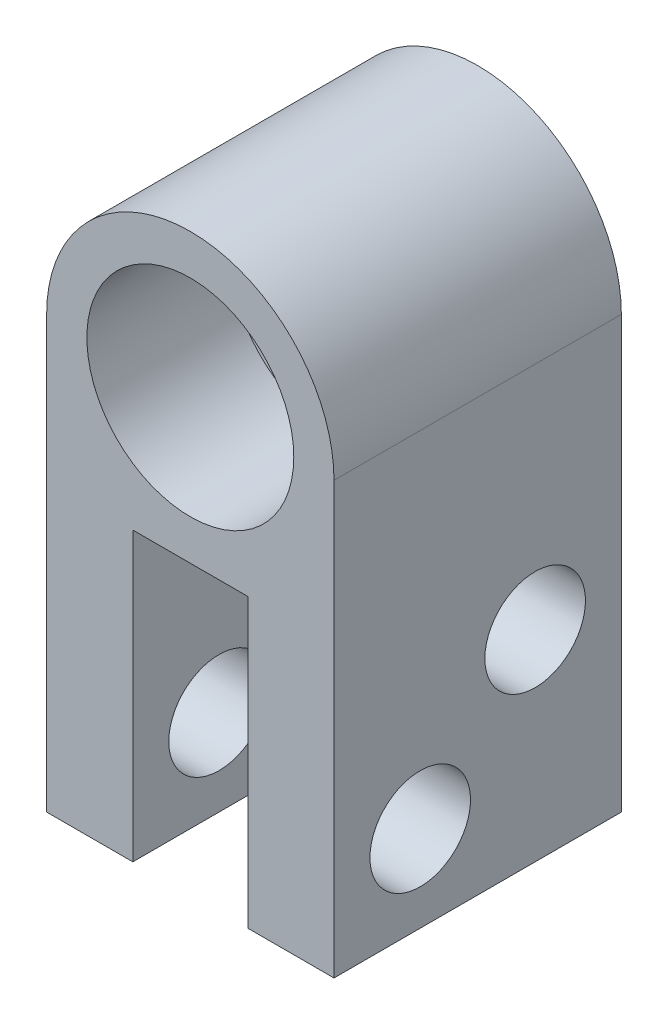
ISO-10303-21;
HEADER;
FILE_DESCRIPTION(('STEP AP214'),'2;1');
FILE_NAME('part.step','',(''),(''),'','','');
FILE_SCHEMA(('AUTOMOTIVE_DESIGN { 1 0 10303 214 1 1 1 1 }'));
ENDSEC;
DATA;
#1=APPLICATION_CONTEXT('core data for automotive mechanical design processes');
#2=APPLICATION_PROTOCOL_DEFINITION('international standard','automotive_design',2000,#1);
#3=PRODUCT_CONTEXT('',#1,'mechanical');
#4=PRODUCT('Part','Part','',(#3));
#5=PRODUCT_RELATED_PRODUCT_CATEGORY('part','',(#4));
#6=PRODUCT_DEFINITION_FORMATION('','',#4);
#7=PRODUCT_DEFINITION_CONTEXT('part definition',#1,'design');
#8=PRODUCT_DEFINITION('design','',#6,#7);
#9=PRODUCT_DEFINITION_SHAPE('','',#8);
#10=(LENGTH_UNIT() NAMED_UNIT(*) SI_UNIT(.MILLI.,.METRE.));
#11=(NAMED_UNIT(*) PLANE_ANGLE_UNIT() SI_UNIT($,.RADIAN.));
#12=(NAMED_UNIT(*) SI_UNIT($,.STERADIAN.) SOLID_ANGLE_UNIT());
#13=UNCERTAINTY_MEASURE_WITH_UNIT(LENGTH_MEASURE(1.E-05),#10,'distance_accuracy_value','');
#14=(GEOMETRIC_REPRESENTATION_CONTEXT(3) GLOBAL_UNCERTAINTY_ASSIGNED_CONTEXT((#13)) GLOBAL_UNIT_ASSIGNED_CONTEXT((#10,
#11,#12)) REPRESENTATION_CONTEXT('',''));
#15=CARTESIAN_POINT('',(0.,0.,0.));
#16=DIRECTION('',(0.,0.,1.));
#17=DIRECTION('',(1.,0.,0.));
#18=AXIS2_PLACEMENT_3D('',#15,#16,#17);
#19=CARTESIAN_POINT('',(0.,0.,10.));
#20=DIRECTION('',(0.,0.,-1.));
#21=DIRECTION('',(-1.,0.,0.));
#22=AXIS2_PLACEMENT_3D('',#19,#20,#21);
#23=CYLINDRICAL_SURFACE('',#22,5.);
#24=DIRECTION('',(0.,0.,1.));
#25=VECTOR('',#24,1.);
#26=CARTESIAN_POINT('',(-5.,0.,0.));
#27=LINE('',#26,#25);
#28=CARTESIAN_POINT('',(-5.,0.,0.));
#29=VERTEX_POINT('',#28);
#30=CARTESIAN_POINT('',(-5.,0.,10.));
#31=VERTEX_POINT('',#30);
#32=EDGE_CURVE('E150',#29,#31,#27,.T.);
#33=ORIENTED_EDGE('',*,*,#32,.T.);
#34=CARTESIAN_POINT('',(0.,0.,10.));
#35=DIRECTION('',(0.,0.,1.));
#36=DIRECTION('',(1.,0.,0.));
#37=AXIS2_PLACEMENT_3D('',#34,#35,#36);
#38=CIRCLE('',#37,5.);
#39=CARTESIAN_POINT('',(5.,0.,10.));
#40=VERTEX_POINT('',#39);
#41=EDGE_CURVE('E11',#40,#31,#38,.T.);
#42=ORIENTED_EDGE('',*,*,#41,.F.);
#43=DIRECTION('',(0.,0.,1.));
#44=VECTOR('',#43,1.);
#45=CARTESIAN_POINT('',(5.,0.,0.));
#46=LINE('',#45,#44);
#47=CARTESIAN_POINT('',(5.,0.,0.));
#48=VERTEX_POINT('',#47);
#49=EDGE_CURVE('E117',#48,#40,#46,.T.);
#50=ORIENTED_EDGE('',*,*,#49,.F.);
#51=CARTESIAN_POINT('',(0.,0.,0.));
#52=DIRECTION('',(0.,0.,1.));
#53=DIRECTION('',(1.,0.,0.));
#54=AXIS2_PLACEMENT_3D('',#51,#52,#53);
#55=CIRCLE('',#54,5.);
#56=EDGE_CURVE('E43',#48,#29,#55,.T.);
#57=ORIENTED_EDGE('',*,*,#56,.T.);
#58=EDGE_LOOP('',(#33,#42,#50,#57));
#59=FACE_BOUND('',#58,.T.);
#60=ADVANCED_FACE('F35',(#59),#23,.T.);
#61=CARTESIAN_POINT('',(0.,0.,10.));
#62=DIRECTION('',(0.,0.,-1.));
#63=DIRECTION('',(-1.,0.,0.));
#64=AXIS2_PLACEMENT_3D('',#61,#62,#63);
#65=CYLINDRICAL_SURFACE('',#64,1.75);
#66=CARTESIAN_POINT('',(0.,0.,0.));
#67=DIRECTION('',(0.,0.,1.));
#68=DIRECTION('',(1.,0.,0.));
#69=AXIS2_PLACEMENT_3D('',#66,#67,#68);
#70=CIRCLE('',#69,1.75);
#71=CARTESIAN_POINT('',(1.75,0.,0.));
#72=VERTEX_POINT('',#71);
#73=EDGE_CURVE('E170',#72,#72,#70,.T.);
#74=ORIENTED_EDGE('',*,*,#73,.F.);
#75=EDGE_LOOP('',(#74));
#76=FACE_BOUND('',#75,.T.);
#77=CARTESIAN_POINT('',(0.,0.,5.));
#78=DIRECTION('',(0.,0.,1.));
#79=DIRECTION('',(1.,0.,0.));
#80=AXIS2_PLACEMENT_3D('',#77,#78,#79);
#81=CIRCLE('',#80,1.75);
#82=CARTESIAN_POINT('',(1.75,0.,5.));
#83=VERTEX_POINT('',#82);
#84=EDGE_CURVE('E167',#83,#83,#81,.T.);
#85=ORIENTED_EDGE('',*,*,#84,.T.);
#86=EDGE_LOOP('',(#85));
#87=FACE_BOUND('',#86,.T.);
#88=ADVANCED_FACE('F237',(#76,#87),#65,.F.);
#89=CARTESIAN_POINT('',(0.,0.,10.));
#90=DIRECTION('',(0.,0.,1.));
#91=DIRECTION('',(1.,0.,0.));
#92=AXIS2_PLACEMENT_3D('',#89,#90,#91);
#93=PLANE('',#92);
#94=ORIENTED_EDGE('',*,*,#41,.T.);
#95=DIRECTION('',(0.,1.,0.));
#96=VECTOR('',#95,1.);
#97=CARTESIAN_POINT('',(-5.,0.,10.));
#98=LINE('',#97,#96);
#99=CARTESIAN_POINT('',(-5.,-15.,10.));
#100=VERTEX_POINT('',#99);
#101=EDGE_CURVE('E89',#100,#31,#98,.T.);
#102=ORIENTED_EDGE('',*,*,#101,.F.);
#103=DIRECTION('',(-1.,0.,0.));
#104=VECTOR('',#103,1.);
#105=CARTESIAN_POINT('',(0.,-15.,10.));
#106=LINE('',#105,#104);
#107=CARTESIAN_POINT('',(-2.,-15.,10.));
#108=VERTEX_POINT('',#107);
#109=EDGE_CURVE('E137',#108,#100,#106,.T.);
#110=ORIENTED_EDGE('',*,*,#109,.F.);
#111=DIRECTION('',(0.,-1.,0.));
#112=VECTOR('',#111,1.);
#113=CARTESIAN_POINT('',(-2.,0.,10.));
#114=LINE('',#113,#112);
#115=CARTESIAN_POINT('',(-2.,-5.,10.));
#116=VERTEX_POINT('',#115);
#117=EDGE_CURVE('E140',#116,#108,#114,.T.);
#118=ORIENTED_EDGE('',*,*,#117,.F.);
#119=DIRECTION('',(-1.,0.,0.));
#120=VECTOR('',#119,1.);
#121=CARTESIAN_POINT('',(0.,-5.,10.));
#122=LINE('',#121,#120);
#123=CARTESIAN_POINT('',(2.,-5.,10.));
#124=VERTEX_POINT('',#123);
#125=EDGE_CURVE('E142',#124,#116,#122,.T.);
#126=ORIENTED_EDGE('',*,*,#125,.F.);
#127=DIRECTION('',(0.,-1.,0.));
#128=VECTOR('',#127,1.);
#129=CARTESIAN_POINT('',(2.,0.,10.));
#130=LINE('',#129,#128);
#131=CARTESIAN_POINT('',(2.,-15.,10.));
#132=VERTEX_POINT('',#131);
#133=EDGE_CURVE('E144',#124,#132,#130,.T.);
#134=ORIENTED_EDGE('',*,*,#133,.T.);
#135=DIRECTION('',(1.,0.,0.));
#136=VECTOR('',#135,1.);
#137=CARTESIAN_POINT('',(0.,-15.,10.));
#138=LINE('',#137,#136);
#139=CARTESIAN_POINT('',(5.,-15.,10.));
#140=VERTEX_POINT('',#139);
#141=EDGE_CURVE('E147',#132,#140,#138,.T.);
#142=ORIENTED_EDGE('',*,*,#141,.T.);
#143=DIRECTION('',(0.,1.,0.));
#144=VECTOR('',#143,1.);
#145=CARTESIAN_POINT('',(5.,0.,10.));
#146=LINE('',#145,#144);
#147=EDGE_CURVE('E50',#140,#40,#146,.T.);
#148=ORIENTED_EDGE('',*,*,#147,.T.);
#149=EDGE_LOOP('',(#94,#102,#110,#118,#126,#134,#142,#148));
#150=FACE_BOUND('',#149,.T.);
#151=CARTESIAN_POINT('',(0.,0.,10.));
#152=DIRECTION('',(0.,0.,1.));
#153=DIRECTION('',(1.,0.,0.));
#154=AXIS2_PLACEMENT_3D('',#151,#152,#153);
#155=CIRCLE('',#154,3.6);
#156=CARTESIAN_POINT('',(3.6,0.,10.));
#157=VERTEX_POINT('',#156);
#158=EDGE_CURVE('E152',#157,#157,#155,.T.);
#159=ORIENTED_EDGE('',*,*,#158,.F.);
#160=EDGE_LOOP('',(#159));
#161=FACE_BOUND('',#160,.T.);
#162=ADVANCED_FACE('F218',(#150,#161),#93,.T.);
#163=CARTESIAN_POINT('',(0.,0.,0.));
#164=DIRECTION('',(0.,0.,1.));
#165=DIRECTION('',(1.,0.,0.));
#166=AXIS2_PLACEMENT_3D('',#163,#164,#165);
#167=PLANE('',#166);
#168=DIRECTION('',(0.,-1.,0.));
#169=VECTOR('',#168,1.);
#170=CARTESIAN_POINT('',(2.,0.,0.));
#171=LINE('',#170,#169);
#172=CARTESIAN_POINT('',(2.,-5.,0.));
#173=VERTEX_POINT('',#172);
#174=CARTESIAN_POINT('',(2.,-15.,0.));
#175=VERTEX_POINT('',#174);
#176=EDGE_CURVE('E130',#173,#175,#171,.T.);
#177=ORIENTED_EDGE('',*,*,#176,.F.);
#178=DIRECTION('',(-1.,0.,0.));
#179=VECTOR('',#178,1.);
#180=CARTESIAN_POINT('',(0.,-5.,0.));
#181=LINE('',#180,#179);
#182=CARTESIAN_POINT('',(-2.,-5.,0.));
#183=VERTEX_POINT('',#182);
#184=EDGE_CURVE('E132',#173,#183,#181,.T.);
#185=ORIENTED_EDGE('',*,*,#184,.T.);
#186=DIRECTION('',(0.,-1.,0.));
#187=VECTOR('',#186,1.);
#188=CARTESIAN_POINT('',(-2.,0.,0.));
#189=LINE('',#188,#187);
#190=CARTESIAN_POINT('',(-2.,-15.,0.));
#191=VERTEX_POINT('',#190);
#192=EDGE_CURVE('E201',#183,#191,#189,.T.);
#193=ORIENTED_EDGE('',*,*,#192,.T.);
#194=DIRECTION('',(-1.,0.,0.));
#195=VECTOR('',#194,1.);
#196=CARTESIAN_POINT('',(0.,-15.,0.));
#197=LINE('',#196,#195);
#198=CARTESIAN_POINT('',(-5.,-15.,0.));
#199=VERTEX_POINT('',#198);
#200=EDGE_CURVE('E95',#191,#199,#197,.T.);
#201=ORIENTED_EDGE('',*,*,#200,.T.);
#202=DIRECTION('',(0.,1.,0.));
#203=VECTOR('',#202,1.);
#204=CARTESIAN_POINT('',(-5.,0.,0.));
#205=LINE('',#204,#203);
#206=EDGE_CURVE('E59',#199,#29,#205,.T.);
#207=ORIENTED_EDGE('',*,*,#206,.T.);
#208=ORIENTED_EDGE('',*,*,#56,.F.);
#209=DIRECTION('',(0.,1.,0.));
#210=VECTOR('',#209,1.);
#211=CARTESIAN_POINT('',(5.,0.,0.));
#212=LINE('',#211,#210);
#213=CARTESIAN_POINT('',(5.,-15.,0.));
#214=VERTEX_POINT('',#213);
#215=EDGE_CURVE('E112',#214,#48,#212,.T.);
#216=ORIENTED_EDGE('',*,*,#215,.F.);
#217=DIRECTION('',(1.,0.,0.));
#218=VECTOR('',#217,1.);
#219=CARTESIAN_POINT('',(0.,-15.,0.));
#220=LINE('',#219,#218);
#221=EDGE_CURVE('E124',#175,#214,#220,.T.);
#222=ORIENTED_EDGE('',*,*,#221,.F.);
#223=EDGE_LOOP('',(#177,#185,#193,#201,#207,#208,#216,#222));
#224=FACE_BOUND('',#223,.T.);
#225=ORIENTED_EDGE('',*,*,#73,.T.);
#226=EDGE_LOOP('',(#225));
#227=FACE_BOUND('',#226,.T.);
#228=ADVANCED_FACE('F122',(#224,#227),#167,.F.);
#229=CARTESIAN_POINT('',(0.,0.,5.));
#230=DIRECTION('',(0.,0.,1.));
#231=DIRECTION('',(1.,0.,0.));
#232=AXIS2_PLACEMENT_3D('',#229,#230,#231);
#233=CYLINDRICAL_SURFACE('',#232,3.6);
#234=CARTESIAN_POINT('',(0.,0.,5.));
#235=DIRECTION('',(0.,0.,1.));
#236=DIRECTION('',(1.,0.,0.));
#237=AXIS2_PLACEMENT_3D('',#234,#235,#236);
#238=CIRCLE('',#237,3.6);
#239=CARTESIAN_POINT('',(3.6,0.,5.));
#240=VERTEX_POINT('',#239);
#241=EDGE_CURVE('E164',#240,#240,#238,.T.);
#242=ORIENTED_EDGE('',*,*,#241,.F.);
#243=EDGE_LOOP('',(#242));
#244=FACE_BOUND('',#243,.T.);
#245=ORIENTED_EDGE('',*,*,#158,.T.);
#246=EDGE_LOOP('',(#245));
#247=FACE_BOUND('',#246,.T.);
#248=ADVANCED_FACE('F250',(#244,#247),#233,.F.);
#249=CARTESIAN_POINT('',(0.,0.,5.));
#250=DIRECTION('',(0.,0.,1.));
#251=DIRECTION('',(1.,0.,0.));
#252=AXIS2_PLACEMENT_3D('',#249,#250,#251);
#253=PLANE('',#252);
#254=ORIENTED_EDGE('',*,*,#84,.F.);
#255=EDGE_LOOP('',(#254));
#256=FACE_BOUND('',#255,.T.);
#257=ORIENTED_EDGE('',*,*,#241,.T.);
#258=EDGE_LOOP('',(#257));
#259=FACE_BOUND('',#258,.T.);
#260=ADVANCED_FACE('F256',(#256,#259),#253,.T.);
#261=CARTESIAN_POINT('',(0.,-5.,0.));
#262=DIRECTION('',(0.,1.,0.));
#263=DIRECTION('',(0.,0.,1.));
#264=AXIS2_PLACEMENT_3D('',#261,#262,#263);
#265=PLANE('',#264);
#266=ORIENTED_EDGE('',*,*,#125,.T.);
#267=DIRECTION('',(0.,0.,1.));
#268=VECTOR('',#267,1.);
#269=CARTESIAN_POINT('',(-2.,-5.,0.));
#270=LINE('',#269,#268);
#271=EDGE_CURVE('E157',#183,#116,#270,.T.);
#272=ORIENTED_EDGE('',*,*,#271,.F.);
#273=ORIENTED_EDGE('',*,*,#184,.F.);
#274=DIRECTION('',(0.,0.,1.));
#275=VECTOR('',#274,1.);
#276=CARTESIAN_POINT('',(2.,-5.,0.));
#277=LINE('',#276,#275);
#278=EDGE_CURVE('E155',#173,#124,#277,.T.);
#279=ORIENTED_EDGE('',*,*,#278,.T.);
#280=EDGE_LOOP('',(#266,#272,#273,#279));
#281=FACE_BOUND('',#280,.T.);
#282=ADVANCED_FACE('F207',(#281),#265,.F.);
#283=CARTESIAN_POINT('',(-5.,0.,0.));
#284=DIRECTION('',(1.,0.,0.));
#285=DIRECTION('',(0.,0.,-1.));
#286=AXIS2_PLACEMENT_3D('',#283,#284,#285);
#287=PLANE('',#286);
#288=CARTESIAN_POINT('',(-5.,-12.,7.));
#289=DIRECTION('',(-1.,0.,0.));
#290=DIRECTION('',(0.,0.,1.));
#291=AXIS2_PLACEMENT_3D('',#288,#289,#290);
#292=CIRCLE('',#291,1.75);
#293=CARTESIAN_POINT('',(-5.,-12.,8.75));
#294=VERTEX_POINT('',#293);
#295=EDGE_CURVE('E184',#294,#294,#292,.T.);
#296=ORIENTED_EDGE('',*,*,#295,.F.);
#297=EDGE_LOOP('',(#296));
#298=FACE_BOUND('',#297,.T.);
#299=CARTESIAN_POINT('',(-5.,-8.,3.));
#300=DIRECTION('',(-1.,0.,0.));
#301=DIRECTION('',(0.,0.,1.));
#302=AXIS2_PLACEMENT_3D('',#299,#300,#301);
#303=CIRCLE('',#302,1.75);
#304=CARTESIAN_POINT('',(-5.,-8.,4.75));
#305=VERTEX_POINT('',#304);
#306=EDGE_CURVE('E194',#305,#305,#303,.T.);
#307=ORIENTED_EDGE('',*,*,#306,.F.);
#308=EDGE_LOOP('',(#307));
#309=FACE_BOUND('',#308,.T.);
#310=ORIENTED_EDGE('',*,*,#101,.T.);
#311=ORIENTED_EDGE('',*,*,#32,.F.);
#312=ORIENTED_EDGE('',*,*,#206,.F.);
#313=DIRECTION('',(0.,0.,1.));
#314=VECTOR('',#313,1.);
#315=CARTESIAN_POINT('',(-5.,-15.,0.));
#316=LINE('',#315,#314);
#317=EDGE_CURVE('E127',#199,#100,#316,.T.);
#318=ORIENTED_EDGE('',*,*,#317,.T.);
#319=EDGE_LOOP('',(#310,#311,#312,#318));
#320=FACE_BOUND('',#319,.T.);
#321=ADVANCED_FACE('F215',(#298,#309,#320),#287,.F.);
#322=CARTESIAN_POINT('',(5.,0.,0.));
#323=DIRECTION('',(1.,0.,0.));
#324=DIRECTION('',(0.,0.,-1.));
#325=AXIS2_PLACEMENT_3D('',#322,#323,#324);
#326=PLANE('',#325);
#327=CARTESIAN_POINT('',(5.,-12.,7.));
#328=DIRECTION('',(-1.,0.,0.));
#329=DIRECTION('',(0.,0.,1.));
#330=AXIS2_PLACEMENT_3D('',#327,#328,#329);
#331=CIRCLE('',#330,1.75);
#332=CARTESIAN_POINT('',(5.,-12.,8.75));
#333=VERTEX_POINT('',#332);
#334=EDGE_CURVE('E178',#333,#333,#331,.T.);
#335=ORIENTED_EDGE('',*,*,#334,.T.);
#336=EDGE_LOOP('',(#335));
#337=FACE_BOUND('',#336,.T.);
#338=CARTESIAN_POINT('',(5.,-8.,3.));
#339=DIRECTION('',(-1.,0.,0.));
#340=DIRECTION('',(0.,0.,1.));
#341=AXIS2_PLACEMENT_3D('',#338,#339,#340);
#342=CIRCLE('',#341,1.75);
#343=CARTESIAN_POINT('',(5.,-8.,4.75));
#344=VERTEX_POINT('',#343);
#345=EDGE_CURVE('E189',#344,#344,#342,.T.);
#346=ORIENTED_EDGE('',*,*,#345,.T.);
#347=EDGE_LOOP('',(#346));
#348=FACE_BOUND('',#347,.T.);
#349=ORIENTED_EDGE('',*,*,#147,.F.);
#350=DIRECTION('',(0.,0.,1.));
#351=VECTOR('',#350,1.);
#352=CARTESIAN_POINT('',(5.,-15.,0.));
#353=LINE('',#352,#351);
#354=EDGE_CURVE('E109',#214,#140,#353,.T.);
#355=ORIENTED_EDGE('',*,*,#354,.F.);
#356=ORIENTED_EDGE('',*,*,#215,.T.);
#357=ORIENTED_EDGE('',*,*,#49,.T.);
#358=EDGE_LOOP('',(#349,#355,#356,#357));
#359=FACE_BOUND('',#358,.T.);
#360=ADVANCED_FACE('F111',(#337,#348,#359),#326,.T.);
#361=CARTESIAN_POINT('',(0.,-15.,0.));
#362=DIRECTION('',(0.,-1.,0.));
#363=DIRECTION('',(0.,0.,-1.));
#364=AXIS2_PLACEMENT_3D('',#361,#362,#363);
#365=PLANE('',#364);
#366=ORIENTED_EDGE('',*,*,#141,.F.);
#367=DIRECTION('',(0.,0.,1.));
#368=VECTOR('',#367,1.);
#369=CARTESIAN_POINT('',(2.,-15.,0.));
#370=LINE('',#369,#368);
#371=EDGE_CURVE('E118',#175,#132,#370,.T.);
#372=ORIENTED_EDGE('',*,*,#371,.F.);
#373=ORIENTED_EDGE('',*,*,#221,.T.);
#374=ORIENTED_EDGE('',*,*,#354,.T.);
#375=EDGE_LOOP('',(#366,#372,#373,#374));
#376=FACE_BOUND('',#375,.T.);
#377=ADVANCED_FACE('F129',(#376),#365,.T.);
#378=CARTESIAN_POINT('',(2.,0.,0.));
#379=DIRECTION('',(-1.,0.,0.));
#380=DIRECTION('',(0.,-1.,0.));
#381=AXIS2_PLACEMENT_3D('',#378,#379,#380);
#382=PLANE('',#381);
#383=CARTESIAN_POINT('',(2.,-12.,7.));
#384=DIRECTION('',(-1.,0.,0.));
#385=DIRECTION('',(0.,-1.,0.));
#386=AXIS2_PLACEMENT_3D('',#383,#384,#385);
#387=CIRCLE('',#386,1.75);
#388=CARTESIAN_POINT('',(2.,-13.75,7.));
#389=VERTEX_POINT('',#388);
#390=EDGE_CURVE('E138',#389,#389,#387,.T.);
#391=ORIENTED_EDGE('',*,*,#390,.F.);
#392=EDGE_LOOP('',(#391));
#393=FACE_BOUND('',#392,.T.);
#394=CARTESIAN_POINT('',(2.,-8.,3.));
#395=DIRECTION('',(-1.,0.,0.));
#396=DIRECTION('',(0.,-1.,0.));
#397=AXIS2_PLACEMENT_3D('',#394,#395,#396);
#398=CIRCLE('',#397,1.75);
#399=CARTESIAN_POINT('',(2.,-9.75,3.));
#400=VERTEX_POINT('',#399);
#401=EDGE_CURVE('E177',#400,#400,#398,.T.);
#402=ORIENTED_EDGE('',*,*,#401,.F.);
#403=EDGE_LOOP('',(#402));
#404=FACE_BOUND('',#403,.T.);
#405=ORIENTED_EDGE('',*,*,#133,.F.);
#406=ORIENTED_EDGE('',*,*,#278,.F.);
#407=ORIENTED_EDGE('',*,*,#176,.T.);
#408=ORIENTED_EDGE('',*,*,#371,.T.);
#409=EDGE_LOOP('',(#405,#406,#407,#408));
#410=FACE_BOUND('',#409,.T.);
#411=ADVANCED_FACE('F222',(#393,#404,#410),#382,.T.);
#412=CARTESIAN_POINT('',(-2.,0.,0.));
#413=DIRECTION('',(-1.,0.,0.));
#414=DIRECTION('',(0.,-1.,0.));
#415=AXIS2_PLACEMENT_3D('',#412,#413,#414);
#416=PLANE('',#415);
#417=CARTESIAN_POINT('',(-2.,-12.,7.));
#418=DIRECTION('',(-1.,0.,0.));
#419=DIRECTION('',(0.,-1.,0.));
#420=AXIS2_PLACEMENT_3D('',#417,#418,#419);
#421=CIRCLE('',#420,1.75);
#422=CARTESIAN_POINT('',(-2.,-13.75,7.));
#423=VERTEX_POINT('',#422);
#424=EDGE_CURVE('E38',#423,#423,#421,.T.);
#425=ORIENTED_EDGE('',*,*,#424,.T.);
#426=EDGE_LOOP('',(#425));
#427=FACE_BOUND('',#426,.T.);
#428=CARTESIAN_POINT('',(-2.,-8.,3.));
#429=DIRECTION('',(-1.,0.,0.));
#430=DIRECTION('',(0.,-1.,0.));
#431=AXIS2_PLACEMENT_3D('',#428,#429,#430);
#432=CIRCLE('',#431,1.75);
#433=CARTESIAN_POINT('',(-2.,-9.75,3.));
#434=VERTEX_POINT('',#433);
#435=EDGE_CURVE('E175',#434,#434,#432,.T.);
#436=ORIENTED_EDGE('',*,*,#435,.T.);
#437=EDGE_LOOP('',(#436));
#438=FACE_BOUND('',#437,.T.);
#439=ORIENTED_EDGE('',*,*,#117,.T.);
#440=DIRECTION('',(0.,0.,1.));
#441=VECTOR('',#440,1.);
#442=CARTESIAN_POINT('',(-2.,-15.,0.));
#443=LINE('',#442,#441);
#444=EDGE_CURVE('E160',#191,#108,#443,.T.);
#445=ORIENTED_EDGE('',*,*,#444,.F.);
#446=ORIENTED_EDGE('',*,*,#192,.F.);
#447=ORIENTED_EDGE('',*,*,#271,.T.);
#448=EDGE_LOOP('',(#439,#445,#446,#447));
#449=FACE_BOUND('',#448,.T.);
#450=ADVANCED_FACE('F211',(#427,#438,#449),#416,.F.);
#451=CARTESIAN_POINT('',(0.,-15.,0.));
#452=DIRECTION('',(0.,1.,0.));
#453=DIRECTION('',(0.,0.,1.));
#454=AXIS2_PLACEMENT_3D('',#451,#452,#453);
#455=PLANE('',#454);
#456=ORIENTED_EDGE('',*,*,#109,.T.);
#457=ORIENTED_EDGE('',*,*,#317,.F.);
#458=ORIENTED_EDGE('',*,*,#200,.F.);
#459=ORIENTED_EDGE('',*,*,#444,.T.);
#460=EDGE_LOOP('',(#456,#457,#458,#459));
#461=FACE_BOUND('',#460,.T.);
#462=ADVANCED_FACE('F214',(#461),#455,.F.);
#463=CARTESIAN_POINT('',(5.,-8.,3.));
#464=DIRECTION('',(-1.,0.,0.));
#465=DIRECTION('',(0.,0.,1.));
#466=AXIS2_PLACEMENT_3D('',#463,#464,#465);
#467=CYLINDRICAL_SURFACE('',#466,1.75);
#468=ORIENTED_EDGE('',*,*,#306,.T.);
#469=EDGE_LOOP('',(#468));
#470=FACE_BOUND('',#469,.T.);
#471=ORIENTED_EDGE('',*,*,#435,.F.);
#472=EDGE_LOOP('',(#471));
#473=FACE_BOUND('',#472,.T.);
#474=ADVANCED_FACE('F275',(#470,#473),#467,.F.);
#475=CARTESIAN_POINT('',(5.,-12.,7.));
#476=DIRECTION('',(-1.,0.,0.));
#477=DIRECTION('',(0.,0.,1.));
#478=AXIS2_PLACEMENT_3D('',#475,#476,#477);
#479=CYLINDRICAL_SURFACE('',#478,1.75);
#480=ORIENTED_EDGE('',*,*,#295,.T.);
#481=EDGE_LOOP('',(#480));
#482=FACE_BOUND('',#481,.T.);
#483=ORIENTED_EDGE('',*,*,#424,.F.);
#484=EDGE_LOOP('',(#483));
#485=FACE_BOUND('',#484,.T.);
#486=ADVANCED_FACE('F279',(#482,#485),#479,.F.);
#487=ORIENTED_EDGE('',*,*,#401,.T.);
#488=EDGE_LOOP('',(#487));
#489=FACE_BOUND('',#488,.T.);
#490=ORIENTED_EDGE('',*,*,#345,.F.);
#491=EDGE_LOOP('',(#490));
#492=FACE_BOUND('',#491,.T.);
#493=ADVANCED_FACE('F282',(#489,#492),#467,.F.);
#494=ORIENTED_EDGE('',*,*,#390,.T.);
#495=EDGE_LOOP('',(#494));
#496=FACE_BOUND('',#495,.T.);
#497=ORIENTED_EDGE('',*,*,#334,.F.);
#498=EDGE_LOOP('',(#497));
#499=FACE_BOUND('',#498,.T.);
#500=ADVANCED_FACE('F288',(#496,#499),#479,.F.);
#501=CLOSED_SHELL('',(#60,#88,#162,#228,#248,#260,#282,#321,#360,#377,#411,#450,#462,#474,#486,
#493,#500));
#502=MANIFOLD_SOLID_BREP('B2',#501);
#503=ADVANCED_BREP_SHAPE_REPRESENTATION('',(#18,#502),#14);
#504=SHAPE_DEFINITION_REPRESENTATION(#9,#503);
ENDSEC;
END-ISO-10303-21;
